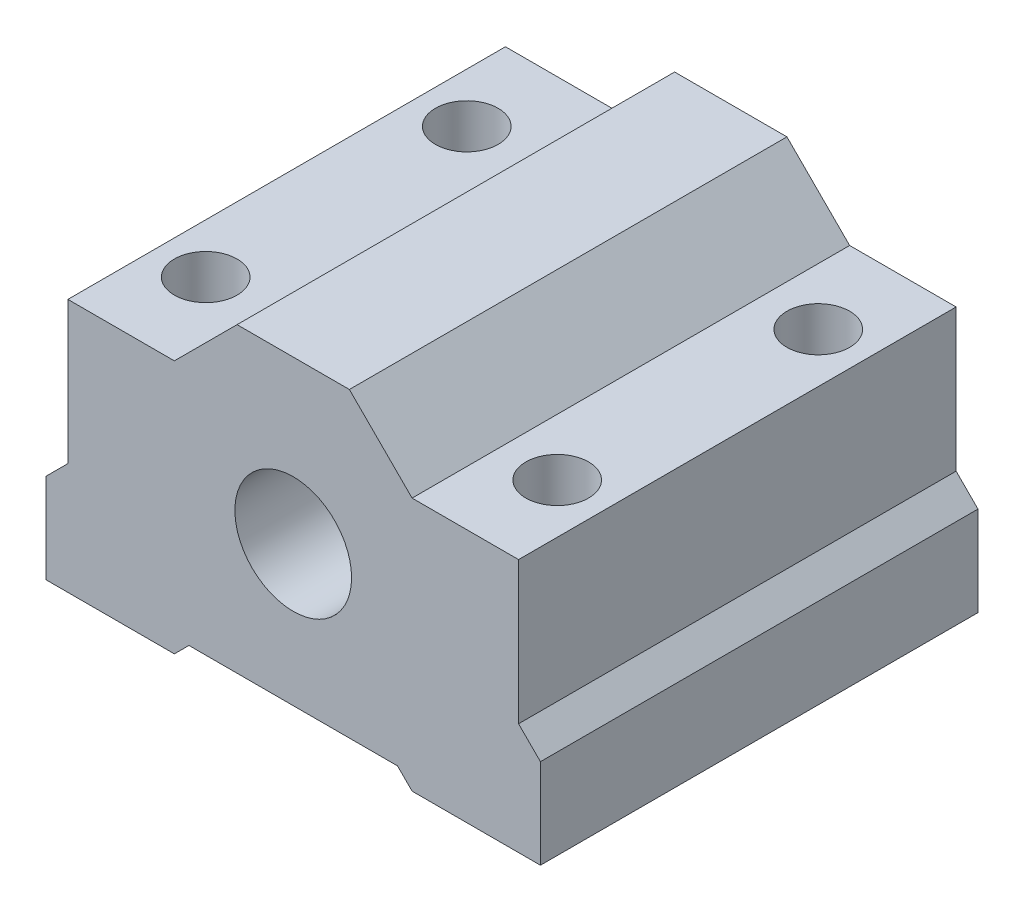
ISO-10303-21;
HEADER;
FILE_DESCRIPTION(('STEP AP214'),'2;1');
FILE_NAME('part.step','',(''),(''),'','','');
FILE_SCHEMA(('AUTOMOTIVE_DESIGN { 1 0 10303 214 1 1 1 1 }'));
ENDSEC;
DATA;
#1=APPLICATION_CONTEXT('core data for automotive mechanical design processes');
#2=APPLICATION_PROTOCOL_DEFINITION('international standard','automotive_design',2000,#1);
#3=PRODUCT_CONTEXT('',#1,'mechanical');
#4=PRODUCT('Part','Part','',(#3));
#5=PRODUCT_RELATED_PRODUCT_CATEGORY('part','',(#4));
#6=PRODUCT_DEFINITION_FORMATION('','',#4);
#7=PRODUCT_DEFINITION_CONTEXT('part definition',#1,'design');
#8=PRODUCT_DEFINITION('design','',#6,#7);
#9=PRODUCT_DEFINITION_SHAPE('','',#8);
#10=(LENGTH_UNIT() NAMED_UNIT(*) SI_UNIT(.MILLI.,.METRE.));
#11=(NAMED_UNIT(*) PLANE_ANGLE_UNIT() SI_UNIT($,.RADIAN.));
#12=(NAMED_UNIT(*) SI_UNIT($,.STERADIAN.) SOLID_ANGLE_UNIT());
#13=UNCERTAINTY_MEASURE_WITH_UNIT(LENGTH_MEASURE(1.E-05),#10,'distance_accuracy_value','');
#14=(GEOMETRIC_REPRESENTATION_CONTEXT(3) GLOBAL_UNCERTAINTY_ASSIGNED_CONTEXT((#13)) GLOBAL_UNIT_ASSIGNED_CONTEXT((#10,
#11,#12)) REPRESENTATION_CONTEXT('',''));
#15=CARTESIAN_POINT('',(0.,0.,0.));
#16=DIRECTION('',(0.,0.,1.));
#17=DIRECTION('',(1.,0.,0.));
#18=AXIS2_PLACEMENT_3D('',#15,#16,#17);
#19=CARTESIAN_POINT('',(0.,0.,30.));
#20=DIRECTION('',(0.,0.,-1.));
#21=DIRECTION('',(-1.,0.,0.));
#22=AXIS2_PLACEMENT_3D('',#19,#20,#21);
#23=PLANE('',#22);
#24=DIRECTION('',(1.,0.,0.));
#25=VECTOR('',#24,1.);
#26=CARTESIAN_POINT('',(0.,0.,30.));
#27=LINE('',#26,#25);
#28=CARTESIAN_POINT('',(0.,0.,30.));
#29=VERTEX_POINT('',#28);
#30=CARTESIAN_POINT('',(8.79999999999995,0.,30.));
#31=VERTEX_POINT('',#30);
#32=EDGE_CURVE('E218',#29,#31,#27,.T.);
#33=ORIENTED_EDGE('',*,*,#32,.T.);
#34=DIRECTION('',(0.707106781186569,0.707106781186526,0.));
#35=VECTOR('',#34,1.);
#36=CARTESIAN_POINT('',(8.79999999999995,0.,30.));
#37=LINE('',#36,#35);
#38=CARTESIAN_POINT('',(9.80000000000002,1.,30.));
#39=VERTEX_POINT('',#38);
#40=EDGE_CURVE('E126',#31,#39,#37,.T.);
#41=ORIENTED_EDGE('',*,*,#40,.T.);
#42=DIRECTION('',(1.,0.,0.));
#43=VECTOR('',#42,1.);
#44=CARTESIAN_POINT('',(9.80000000000002,1.,30.));
#45=LINE('',#44,#43);
#46=CARTESIAN_POINT('',(24.1,1.,30.));
#47=VERTEX_POINT('',#46);
#48=EDGE_CURVE('E292',#39,#47,#45,.T.);
#49=ORIENTED_EDGE('',*,*,#48,.T.);
#50=DIRECTION('',(0.707106781186565,-0.70710678118653,0.));
#51=VECTOR('',#50,1.);
#52=CARTESIAN_POINT('',(24.1,1.,30.));
#53=LINE('',#52,#51);
#54=CARTESIAN_POINT('',(25.1,0.,30.));
#55=VERTEX_POINT('',#54);
#56=EDGE_CURVE('E294',#47,#55,#53,.T.);
#57=ORIENTED_EDGE('',*,*,#56,.T.);
#58=DIRECTION('',(1.,0.,0.));
#59=VECTOR('',#58,1.);
#60=CARTESIAN_POINT('',(25.1,0.,30.));
#61=LINE('',#60,#59);
#62=CARTESIAN_POINT('',(33.9,0.,30.));
#63=VERTEX_POINT('',#62);
#64=EDGE_CURVE('E296',#55,#63,#61,.T.);
#65=ORIENTED_EDGE('',*,*,#64,.T.);
#66=DIRECTION('',(0.,1.,0.));
#67=VECTOR('',#66,1.);
#68=CARTESIAN_POINT('',(33.9,6.14999999999998,30.));
#69=LINE('',#68,#67);
#70=CARTESIAN_POINT('',(33.9,6.14999999999998,30.));
#71=VERTEX_POINT('',#70);
#72=EDGE_CURVE('E298',#63,#71,#69,.T.);
#73=ORIENTED_EDGE('',*,*,#72,.T.);
#74=DIRECTION('',(-0.707106781186546,0.707106781186549,0.));
#75=VECTOR('',#74,1.);
#76=CARTESIAN_POINT('',(32.4,7.65,30.));
#77=LINE('',#76,#75);
#78=CARTESIAN_POINT('',(32.4,7.65,30.));
#79=VERTEX_POINT('',#78);
#80=EDGE_CURVE('E300',#71,#79,#77,.T.);
#81=ORIENTED_EDGE('',*,*,#80,.T.);
#82=DIRECTION('',(0.,1.,0.));
#83=VECTOR('',#82,1.);
#84=CARTESIAN_POINT('',(32.4,17.4,30.));
#85=LINE('',#84,#83);
#86=CARTESIAN_POINT('',(32.4,17.4,30.));
#87=VERTEX_POINT('',#86);
#88=EDGE_CURVE('E302',#79,#87,#85,.T.);
#89=ORIENTED_EDGE('',*,*,#88,.T.);
#90=DIRECTION('',(-1.,0.,0.));
#91=VECTOR('',#90,1.);
#92=CARTESIAN_POINT('',(25.1,17.4,30.));
#93=LINE('',#92,#91);
#94=CARTESIAN_POINT('',(25.1,17.4,30.));
#95=VERTEX_POINT('',#94);
#96=EDGE_CURVE('E304',#87,#95,#93,.T.);
#97=ORIENTED_EDGE('',*,*,#96,.T.);
#98=DIRECTION('',(-0.707106781186546,0.707106781186549,0.));
#99=VECTOR('',#98,1.);
#100=CARTESIAN_POINT('',(20.8000000000001,21.7,30.));
#101=LINE('',#100,#99);
#102=CARTESIAN_POINT('',(20.8000000000001,21.7,30.));
#103=VERTEX_POINT('',#102);
#104=EDGE_CURVE('E306',#95,#103,#101,.T.);
#105=ORIENTED_EDGE('',*,*,#104,.T.);
#106=DIRECTION('',(-1.,0.,0.));
#107=VECTOR('',#106,1.);
#108=CARTESIAN_POINT('',(13.1000000000001,21.7,30.));
#109=LINE('',#108,#107);
#110=CARTESIAN_POINT('',(13.1000000000001,21.7,30.));
#111=VERTEX_POINT('',#110);
#112=EDGE_CURVE('E308',#103,#111,#109,.T.);
#113=ORIENTED_EDGE('',*,*,#112,.T.);
#114=DIRECTION('',(-0.707106781186549,-0.707106781186546,0.));
#115=VECTOR('',#114,1.);
#116=CARTESIAN_POINT('',(8.80000000000005,17.4,30.));
#117=LINE('',#116,#115);
#118=CARTESIAN_POINT('',(8.80000000000005,17.4,30.));
#119=VERTEX_POINT('',#118);
#120=EDGE_CURVE('E310',#111,#119,#117,.T.);
#121=ORIENTED_EDGE('',*,*,#120,.T.);
#122=DIRECTION('',(-1.,0.,0.));
#123=VECTOR('',#122,1.);
#124=CARTESIAN_POINT('',(1.50000000000005,17.4,30.));
#125=LINE('',#124,#123);
#126=CARTESIAN_POINT('',(1.50000000000005,17.4,30.));
#127=VERTEX_POINT('',#126);
#128=EDGE_CURVE('E169',#119,#127,#125,.T.);
#129=ORIENTED_EDGE('',*,*,#128,.T.);
#130=DIRECTION('',(0.,-1.,0.));
#131=VECTOR('',#130,1.);
#132=CARTESIAN_POINT('',(1.49999999999999,7.65,30.));
#133=LINE('',#132,#131);
#134=CARTESIAN_POINT('',(1.49999999999999,7.65,30.));
#135=VERTEX_POINT('',#134);
#136=EDGE_CURVE('E163',#127,#135,#133,.T.);
#137=ORIENTED_EDGE('',*,*,#136,.T.);
#138=DIRECTION('',(-0.707106781186549,-0.707106781186546,0.));
#139=VECTOR('',#138,1.);
#140=CARTESIAN_POINT('',(0.,6.15000000000001,30.));
#141=LINE('',#140,#139);
#142=CARTESIAN_POINT('',(0.,6.15000000000001,30.));
#143=VERTEX_POINT('',#142);
#144=EDGE_CURVE('E167',#135,#143,#141,.T.);
#145=ORIENTED_EDGE('',*,*,#144,.T.);
#146=DIRECTION('',(0.,-1.,0.));
#147=VECTOR('',#146,1.);
#148=CARTESIAN_POINT('',(0.,0.,30.));
#149=LINE('',#148,#147);
#150=EDGE_CURVE('E59',#143,#29,#149,.T.);
#151=ORIENTED_EDGE('',*,*,#150,.T.);
#152=EDGE_LOOP('',(#33,#41,#49,#57,#65,#73,#81,#89,#97,#105,#113,#121,#129,#137,#145,#151));
#153=FACE_BOUND('',#152,.T.);
#154=CARTESIAN_POINT('',(16.95,10.6,30.));
#155=DIRECTION('',(0.,0.,1.));
#156=DIRECTION('',(1.,0.,0.));
#157=AXIS2_PLACEMENT_3D('',#154,#155,#156);
#158=CIRCLE('',#157,4.);
#159=CARTESIAN_POINT('',(20.95,10.6,30.));
#160=VERTEX_POINT('',#159);
#161=EDGE_CURVE('E191',#160,#160,#158,.T.);
#162=ORIENTED_EDGE('',*,*,#161,.F.);
#163=EDGE_LOOP('',(#162));
#164=FACE_BOUND('',#163,.T.);
#165=ADVANCED_FACE('F40',(#153,#164),#23,.F.);
#166=CARTESIAN_POINT('',(0.,0.,0.));
#167=DIRECTION('',(0.,0.,-1.));
#168=DIRECTION('',(-1.,0.,0.));
#169=AXIS2_PLACEMENT_3D('',#166,#167,#168);
#170=PLANE('',#169);
#171=DIRECTION('',(1.,0.,0.));
#172=VECTOR('',#171,1.);
#173=CARTESIAN_POINT('',(0.,0.,0.));
#174=LINE('',#173,#172);
#175=CARTESIAN_POINT('',(0.,0.,0.));
#176=VERTEX_POINT('',#175);
#177=CARTESIAN_POINT('',(8.79999999999995,0.,0.));
#178=VERTEX_POINT('',#177);
#179=EDGE_CURVE('E187',#176,#178,#174,.T.);
#180=ORIENTED_EDGE('',*,*,#179,.F.);
#181=DIRECTION('',(0.,-1.,0.));
#182=VECTOR('',#181,1.);
#183=CARTESIAN_POINT('',(0.,0.,0.));
#184=LINE('',#183,#182);
#185=CARTESIAN_POINT('',(0.,6.15000000000001,0.));
#186=VERTEX_POINT('',#185);
#187=EDGE_CURVE('E118',#186,#176,#184,.T.);
#188=ORIENTED_EDGE('',*,*,#187,.F.);
#189=DIRECTION('',(-0.707106781186549,-0.707106781186546,0.));
#190=VECTOR('',#189,1.);
#191=CARTESIAN_POINT('',(0.,6.15000000000001,0.));
#192=LINE('',#191,#190);
#193=CARTESIAN_POINT('',(1.49999999999999,7.65,0.));
#194=VERTEX_POINT('',#193);
#195=EDGE_CURVE('E112',#194,#186,#192,.T.);
#196=ORIENTED_EDGE('',*,*,#195,.F.);
#197=DIRECTION('',(0.,-1.,0.));
#198=VECTOR('',#197,1.);
#199=CARTESIAN_POINT('',(1.49999999999999,7.65,0.));
#200=LINE('',#199,#198);
#201=CARTESIAN_POINT('',(1.50000000000005,17.4,0.));
#202=VERTEX_POINT('',#201);
#203=EDGE_CURVE('E177',#202,#194,#200,.T.);
#204=ORIENTED_EDGE('',*,*,#203,.F.);
#205=DIRECTION('',(-1.,0.,0.));
#206=VECTOR('',#205,1.);
#207=CARTESIAN_POINT('',(1.50000000000005,17.4,0.));
#208=LINE('',#207,#206);
#209=CARTESIAN_POINT('',(8.80000000000005,17.4,0.));
#210=VERTEX_POINT('',#209);
#211=EDGE_CURVE('E213',#210,#202,#208,.T.);
#212=ORIENTED_EDGE('',*,*,#211,.F.);
#213=DIRECTION('',(-0.707106781186549,-0.707106781186546,0.));
#214=VECTOR('',#213,1.);
#215=CARTESIAN_POINT('',(8.80000000000005,17.4,0.));
#216=LINE('',#215,#214);
#217=CARTESIAN_POINT('',(13.1000000000001,21.7,0.));
#218=VERTEX_POINT('',#217);
#219=EDGE_CURVE('E211',#218,#210,#216,.T.);
#220=ORIENTED_EDGE('',*,*,#219,.F.);
#221=DIRECTION('',(-1.,0.,0.));
#222=VECTOR('',#221,1.);
#223=CARTESIAN_POINT('',(13.1000000000001,21.7,0.));
#224=LINE('',#223,#222);
#225=CARTESIAN_POINT('',(20.8000000000001,21.7,0.));
#226=VERTEX_POINT('',#225);
#227=EDGE_CURVE('E209',#226,#218,#224,.T.);
#228=ORIENTED_EDGE('',*,*,#227,.F.);
#229=DIRECTION('',(-0.707106781186546,0.707106781186549,0.));
#230=VECTOR('',#229,1.);
#231=CARTESIAN_POINT('',(20.8000000000001,21.7,0.));
#232=LINE('',#231,#230);
#233=CARTESIAN_POINT('',(25.1,17.4,0.));
#234=VERTEX_POINT('',#233);
#235=EDGE_CURVE('E207',#234,#226,#232,.T.);
#236=ORIENTED_EDGE('',*,*,#235,.F.);
#237=DIRECTION('',(-1.,0.,0.));
#238=VECTOR('',#237,1.);
#239=CARTESIAN_POINT('',(25.1,17.4,0.));
#240=LINE('',#239,#238);
#241=CARTESIAN_POINT('',(32.4,17.4,0.));
#242=VERTEX_POINT('',#241);
#243=EDGE_CURVE('E205',#242,#234,#240,.T.);
#244=ORIENTED_EDGE('',*,*,#243,.F.);
#245=DIRECTION('',(0.,1.,0.));
#246=VECTOR('',#245,1.);
#247=CARTESIAN_POINT('',(32.4,17.4,0.));
#248=LINE('',#247,#246);
#249=CARTESIAN_POINT('',(32.4,7.65,0.));
#250=VERTEX_POINT('',#249);
#251=EDGE_CURVE('E203',#250,#242,#248,.T.);
#252=ORIENTED_EDGE('',*,*,#251,.F.);
#253=DIRECTION('',(-0.707106781186546,0.707106781186549,0.));
#254=VECTOR('',#253,1.);
#255=CARTESIAN_POINT('',(32.4,7.65,0.));
#256=LINE('',#255,#254);
#257=CARTESIAN_POINT('',(33.9,6.14999999999998,0.));
#258=VERTEX_POINT('',#257);
#259=EDGE_CURVE('E201',#258,#250,#256,.T.);
#260=ORIENTED_EDGE('',*,*,#259,.F.);
#261=DIRECTION('',(0.,1.,0.));
#262=VECTOR('',#261,1.);
#263=CARTESIAN_POINT('',(33.9,6.14999999999998,0.));
#264=LINE('',#263,#262);
#265=CARTESIAN_POINT('',(33.9,0.,0.));
#266=VERTEX_POINT('',#265);
#267=EDGE_CURVE('E199',#266,#258,#264,.T.);
#268=ORIENTED_EDGE('',*,*,#267,.F.);
#269=DIRECTION('',(1.,0.,0.));
#270=VECTOR('',#269,1.);
#271=CARTESIAN_POINT('',(25.1,0.,0.));
#272=LINE('',#271,#270);
#273=CARTESIAN_POINT('',(25.1,0.,0.));
#274=VERTEX_POINT('',#273);
#275=EDGE_CURVE('E197',#274,#266,#272,.T.);
#276=ORIENTED_EDGE('',*,*,#275,.F.);
#277=DIRECTION('',(0.707106781186565,-0.70710678118653,0.));
#278=VECTOR('',#277,1.);
#279=CARTESIAN_POINT('',(24.1,1.,0.));
#280=LINE('',#279,#278);
#281=CARTESIAN_POINT('',(24.1,1.,0.));
#282=VERTEX_POINT('',#281);
#283=EDGE_CURVE('E195',#282,#274,#280,.T.);
#284=ORIENTED_EDGE('',*,*,#283,.F.);
#285=DIRECTION('',(1.,0.,0.));
#286=VECTOR('',#285,1.);
#287=CARTESIAN_POINT('',(9.80000000000002,1.,0.));
#288=LINE('',#287,#286);
#289=CARTESIAN_POINT('',(9.80000000000002,1.,0.));
#290=VERTEX_POINT('',#289);
#291=EDGE_CURVE('E193',#290,#282,#288,.T.);
#292=ORIENTED_EDGE('',*,*,#291,.F.);
#293=DIRECTION('',(0.707106781186569,0.707106781186526,0.));
#294=VECTOR('',#293,1.);
#295=CARTESIAN_POINT('',(8.79999999999995,0.,0.));
#296=LINE('',#295,#294);
#297=EDGE_CURVE('E190',#178,#290,#296,.T.);
#298=ORIENTED_EDGE('',*,*,#297,.F.);
#299=EDGE_LOOP('',(#180,#188,#196,#204,#212,#220,#228,#236,#244,#252,#260,#268,#276,#284,#292,#298));
#300=FACE_BOUND('',#299,.T.);
#301=CARTESIAN_POINT('',(16.95,10.6,0.));
#302=DIRECTION('',(0.,0.,1.));
#303=DIRECTION('',(1.,0.,0.));
#304=AXIS2_PLACEMENT_3D('',#301,#302,#303);
#305=CIRCLE('',#304,4.);
#306=CARTESIAN_POINT('',(20.95,10.6,0.));
#307=VERTEX_POINT('',#306);
#308=EDGE_CURVE('E257',#307,#307,#305,.T.);
#309=ORIENTED_EDGE('',*,*,#308,.T.);
#310=EDGE_LOOP('',(#309));
#311=FACE_BOUND('',#310,.T.);
#312=ADVANCED_FACE('F323',(#300,#311),#170,.T.);
#313=CARTESIAN_POINT('',(0.,0.,30.));
#314=DIRECTION('',(0.,1.,0.));
#315=DIRECTION('',(-1.,0.,0.));
#316=AXIS2_PLACEMENT_3D('',#313,#314,#315);
#317=PLANE('',#316);
#318=CARTESIAN_POINT('',(4.90000000000001,0.,6.05));
#319=DIRECTION('',(0.,-1.,0.));
#320=DIRECTION('',(0.,0.,-1.));
#321=AXIS2_PLACEMENT_3D('',#318,#319,#320);
#322=CIRCLE('',#321,2.98);
#323=CARTESIAN_POINT('',(4.90000000000001,0.,3.07));
#324=VERTEX_POINT('',#323);
#325=EDGE_CURVE('E385',#324,#324,#322,.T.);
#326=ORIENTED_EDGE('',*,*,#325,.F.);
#327=EDGE_LOOP('',(#326));
#328=FACE_BOUND('',#327,.T.);
#329=CARTESIAN_POINT('',(4.90000000000001,0.,23.95));
#330=DIRECTION('',(0.,-1.,0.));
#331=DIRECTION('',(0.,0.,-1.));
#332=AXIS2_PLACEMENT_3D('',#329,#330,#331);
#333=CIRCLE('',#332,2.98);
#334=CARTESIAN_POINT('',(4.90000000000001,0.,20.97));
#335=VERTEX_POINT('',#334);
#336=EDGE_CURVE('E272',#335,#335,#333,.T.);
#337=ORIENTED_EDGE('',*,*,#336,.F.);
#338=EDGE_LOOP('',(#337));
#339=FACE_BOUND('',#338,.T.);
#340=ORIENTED_EDGE('',*,*,#179,.T.);
#341=DIRECTION('',(0.,0.,-1.));
#342=VECTOR('',#341,1.);
#343=CARTESIAN_POINT('',(8.79999999999995,0.,30.));
#344=LINE('',#343,#342);
#345=EDGE_CURVE('E11',#31,#178,#344,.T.);
#346=ORIENTED_EDGE('',*,*,#345,.F.);
#347=ORIENTED_EDGE('',*,*,#32,.F.);
#348=DIRECTION('',(0.,0.,-1.));
#349=VECTOR('',#348,1.);
#350=CARTESIAN_POINT('',(0.,0.,30.));
#351=LINE('',#350,#349);
#352=EDGE_CURVE('E183',#29,#176,#351,.T.);
#353=ORIENTED_EDGE('',*,*,#352,.T.);
#354=EDGE_LOOP('',(#340,#346,#347,#353));
#355=FACE_BOUND('',#354,.T.);
#356=ADVANCED_FACE('F42',(#328,#339,#355),#317,.F.);
#357=CARTESIAN_POINT('',(8.79999999999995,0.,30.));
#358=DIRECTION('',(-0.707106781186526,0.707106781186569,0.));
#359=DIRECTION('',(-0.707106781186569,-0.707106781186526,0.));
#360=AXIS2_PLACEMENT_3D('',#357,#358,#359);
#361=PLANE('',#360);
#362=ORIENTED_EDGE('',*,*,#297,.T.);
#363=DIRECTION('',(0.,0.,-1.));
#364=VECTOR('',#363,1.);
#365=CARTESIAN_POINT('',(9.80000000000002,1.,30.));
#366=LINE('',#365,#364);
#367=EDGE_CURVE('E50',#39,#290,#366,.T.);
#368=ORIENTED_EDGE('',*,*,#367,.F.);
#369=ORIENTED_EDGE('',*,*,#40,.F.);
#370=ORIENTED_EDGE('',*,*,#345,.T.);
#371=EDGE_LOOP('',(#362,#368,#369,#370));
#372=FACE_BOUND('',#371,.T.);
#373=ADVANCED_FACE('F435',(#372),#361,.F.);
#374=CARTESIAN_POINT('',(9.80000000000002,1.,30.));
#375=DIRECTION('',(0.,1.,0.));
#376=DIRECTION('',(0.,0.,1.));
#377=AXIS2_PLACEMENT_3D('',#374,#375,#376);
#378=PLANE('',#377);
#379=ORIENTED_EDGE('',*,*,#291,.T.);
#380=DIRECTION('',(0.,0.,-1.));
#381=VECTOR('',#380,1.);
#382=CARTESIAN_POINT('',(24.1,1.,30.));
#383=LINE('',#382,#381);
#384=EDGE_CURVE('E249',#47,#282,#383,.T.);
#385=ORIENTED_EDGE('',*,*,#384,.F.);
#386=ORIENTED_EDGE('',*,*,#48,.F.);
#387=ORIENTED_EDGE('',*,*,#367,.T.);
#388=EDGE_LOOP('',(#379,#385,#386,#387));
#389=FACE_BOUND('',#388,.T.);
#390=ADVANCED_FACE('F432',(#389),#378,.F.);
#391=CARTESIAN_POINT('',(24.1,1.,30.));
#392=DIRECTION('',(0.70710678118653,0.707106781186565,0.));
#393=DIRECTION('',(-0.707106781186565,0.70710678118653,0.));
#394=AXIS2_PLACEMENT_3D('',#391,#392,#393);
#395=PLANE('',#394);
#396=ORIENTED_EDGE('',*,*,#283,.T.);
#397=DIRECTION('',(0.,0.,-1.));
#398=VECTOR('',#397,1.);
#399=CARTESIAN_POINT('',(25.1,0.,30.));
#400=LINE('',#399,#398);
#401=EDGE_CURVE('E246',#55,#274,#400,.T.);
#402=ORIENTED_EDGE('',*,*,#401,.F.);
#403=ORIENTED_EDGE('',*,*,#56,.F.);
#404=ORIENTED_EDGE('',*,*,#384,.T.);
#405=EDGE_LOOP('',(#396,#402,#403,#404));
#406=FACE_BOUND('',#405,.T.);
#407=ADVANCED_FACE('F428',(#406),#395,.F.);
#408=CARTESIAN_POINT('',(25.1,0.,30.));
#409=DIRECTION('',(0.,1.,0.));
#410=DIRECTION('',(-1.,0.,0.));
#411=AXIS2_PLACEMENT_3D('',#408,#409,#410);
#412=PLANE('',#411);
#413=CARTESIAN_POINT('',(29.,0.,6.05));
#414=DIRECTION('',(0.,-1.,0.));
#415=DIRECTION('',(0.,0.,-1.));
#416=AXIS2_PLACEMENT_3D('',#413,#414,#415);
#417=CIRCLE('',#416,2.98);
#418=CARTESIAN_POINT('',(29.,0.,3.07));
#419=VERTEX_POINT('',#418);
#420=EDGE_CURVE('E265',#419,#419,#417,.T.);
#421=ORIENTED_EDGE('',*,*,#420,.F.);
#422=EDGE_LOOP('',(#421));
#423=FACE_BOUND('',#422,.T.);
#424=CARTESIAN_POINT('',(29.,0.,23.95));
#425=DIRECTION('',(0.,-1.,0.));
#426=DIRECTION('',(0.,0.,-1.));
#427=AXIS2_PLACEMENT_3D('',#424,#425,#426);
#428=CIRCLE('',#427,2.98);
#429=CARTESIAN_POINT('',(29.,0.,20.97));
#430=VERTEX_POINT('',#429);
#431=EDGE_CURVE('E261',#430,#430,#428,.T.);
#432=ORIENTED_EDGE('',*,*,#431,.F.);
#433=EDGE_LOOP('',(#432));
#434=FACE_BOUND('',#433,.T.);
#435=ORIENTED_EDGE('',*,*,#275,.T.);
#436=DIRECTION('',(0.,0.,-1.));
#437=VECTOR('',#436,1.);
#438=CARTESIAN_POINT('',(33.9,0.,30.));
#439=LINE('',#438,#437);
#440=EDGE_CURVE('E243',#63,#266,#439,.T.);
#441=ORIENTED_EDGE('',*,*,#440,.F.);
#442=ORIENTED_EDGE('',*,*,#64,.F.);
#443=ORIENTED_EDGE('',*,*,#401,.T.);
#444=EDGE_LOOP('',(#435,#441,#442,#443));
#445=FACE_BOUND('',#444,.T.);
#446=ADVANCED_FACE('F424',(#423,#434,#445),#412,.F.);
#447=CARTESIAN_POINT('',(33.9,6.14999999999998,30.));
#448=DIRECTION('',(-1.,0.,0.));
#449=DIRECTION('',(0.,0.,1.));
#450=AXIS2_PLACEMENT_3D('',#447,#448,#449);
#451=PLANE('',#450);
#452=ORIENTED_EDGE('',*,*,#267,.T.);
#453=DIRECTION('',(0.,0.,-1.));
#454=VECTOR('',#453,1.);
#455=CARTESIAN_POINT('',(33.9,6.14999999999998,30.));
#456=LINE('',#455,#454);
#457=EDGE_CURVE('E240',#71,#258,#456,.T.);
#458=ORIENTED_EDGE('',*,*,#457,.F.);
#459=ORIENTED_EDGE('',*,*,#72,.F.);
#460=ORIENTED_EDGE('',*,*,#440,.T.);
#461=EDGE_LOOP('',(#452,#458,#459,#460));
#462=FACE_BOUND('',#461,.T.);
#463=ADVANCED_FACE('F420',(#462),#451,.F.);
#464=CARTESIAN_POINT('',(32.4,7.65,30.));
#465=DIRECTION('',(-0.707106781186549,-0.707106781186546,0.));
#466=DIRECTION('',(0.707106781186546,-0.707106781186549,0.));
#467=AXIS2_PLACEMENT_3D('',#464,#465,#466);
#468=PLANE('',#467);
#469=ORIENTED_EDGE('',*,*,#259,.T.);
#470=DIRECTION('',(0.,0.,-1.));
#471=VECTOR('',#470,1.);
#472=CARTESIAN_POINT('',(32.4,7.65,30.));
#473=LINE('',#472,#471);
#474=EDGE_CURVE('E237',#79,#250,#473,.T.);
#475=ORIENTED_EDGE('',*,*,#474,.F.);
#476=ORIENTED_EDGE('',*,*,#80,.F.);
#477=ORIENTED_EDGE('',*,*,#457,.T.);
#478=EDGE_LOOP('',(#469,#475,#476,#477));
#479=FACE_BOUND('',#478,.T.);
#480=ADVANCED_FACE('F416',(#479),#468,.F.);
#481=CARTESIAN_POINT('',(32.4,17.4,30.));
#482=DIRECTION('',(-1.,0.,0.));
#483=DIRECTION('',(0.,-1.,0.));
#484=AXIS2_PLACEMENT_3D('',#481,#482,#483);
#485=PLANE('',#484);
#486=ORIENTED_EDGE('',*,*,#251,.T.);
#487=DIRECTION('',(0.,0.,-1.));
#488=VECTOR('',#487,1.);
#489=CARTESIAN_POINT('',(32.4,17.4,30.));
#490=LINE('',#489,#488);
#491=EDGE_CURVE('E234',#87,#242,#490,.T.);
#492=ORIENTED_EDGE('',*,*,#491,.F.);
#493=ORIENTED_EDGE('',*,*,#88,.F.);
#494=ORIENTED_EDGE('',*,*,#474,.T.);
#495=EDGE_LOOP('',(#486,#492,#493,#494));
#496=FACE_BOUND('',#495,.T.);
#497=ADVANCED_FACE('F412',(#496),#485,.F.);
#498=CARTESIAN_POINT('',(25.1,17.4,30.));
#499=DIRECTION('',(0.,-1.,0.));
#500=DIRECTION('',(0.,0.,-1.));
#501=AXIS2_PLACEMENT_3D('',#498,#499,#500);
#502=PLANE('',#501);
#503=CARTESIAN_POINT('',(29.,17.4,6.05));
#504=DIRECTION('',(0.,-1.,0.));
#505=DIRECTION('',(0.,0.,-1.));
#506=AXIS2_PLACEMENT_3D('',#503,#504,#505);
#507=CIRCLE('',#506,2.15);
#508=CARTESIAN_POINT('',(29.,17.4,3.9));
#509=VERTEX_POINT('',#508);
#510=EDGE_CURVE('E259',#509,#509,#507,.T.);
#511=ORIENTED_EDGE('',*,*,#510,.T.);
#512=EDGE_LOOP('',(#511));
#513=FACE_BOUND('',#512,.T.);
#514=CARTESIAN_POINT('',(29.,17.4,23.95));
#515=DIRECTION('',(0.,-1.,0.));
#516=DIRECTION('',(0.,0.,-1.));
#517=AXIS2_PLACEMENT_3D('',#514,#515,#516);
#518=CIRCLE('',#517,2.15);
#519=CARTESIAN_POINT('',(29.,17.4,21.8));
#520=VERTEX_POINT('',#519);
#521=EDGE_CURVE('E254',#520,#520,#518,.T.);
#522=ORIENTED_EDGE('',*,*,#521,.T.);
#523=EDGE_LOOP('',(#522));
#524=FACE_BOUND('',#523,.T.);
#525=ORIENTED_EDGE('',*,*,#243,.T.);
#526=DIRECTION('',(0.,0.,-1.));
#527=VECTOR('',#526,1.);
#528=CARTESIAN_POINT('',(25.1,17.4,30.));
#529=LINE('',#528,#527);
#530=EDGE_CURVE('E231',#95,#234,#529,.T.);
#531=ORIENTED_EDGE('',*,*,#530,.F.);
#532=ORIENTED_EDGE('',*,*,#96,.F.);
#533=ORIENTED_EDGE('',*,*,#491,.T.);
#534=EDGE_LOOP('',(#525,#531,#532,#533));
#535=FACE_BOUND('',#534,.T.);
#536=ADVANCED_FACE('F409',(#513,#524,#535),#502,.F.);
#537=CARTESIAN_POINT('',(20.8000000000001,21.7,30.));
#538=DIRECTION('',(-0.707106781186549,-0.707106781186546,0.));
#539=DIRECTION('',(0.707106781186546,-0.707106781186549,0.));
#540=AXIS2_PLACEMENT_3D('',#537,#538,#539);
#541=PLANE('',#540);
#542=ORIENTED_EDGE('',*,*,#235,.T.);
#543=DIRECTION('',(0.,0.,-1.));
#544=VECTOR('',#543,1.);
#545=CARTESIAN_POINT('',(20.8000000000001,21.7,30.));
#546=LINE('',#545,#544);
#547=EDGE_CURVE('E228',#103,#226,#546,.T.);
#548=ORIENTED_EDGE('',*,*,#547,.F.);
#549=ORIENTED_EDGE('',*,*,#104,.F.);
#550=ORIENTED_EDGE('',*,*,#530,.T.);
#551=EDGE_LOOP('',(#542,#548,#549,#550));
#552=FACE_BOUND('',#551,.T.);
#553=ADVANCED_FACE('F405',(#552),#541,.F.);
#554=CARTESIAN_POINT('',(13.1000000000001,21.7,30.));
#555=DIRECTION('',(0.,-1.,0.));
#556=DIRECTION('',(0.,0.,-1.));
#557=AXIS2_PLACEMENT_3D('',#554,#555,#556);
#558=PLANE('',#557);
#559=ORIENTED_EDGE('',*,*,#227,.T.);
#560=DIRECTION('',(0.,0.,-1.));
#561=VECTOR('',#560,1.);
#562=CARTESIAN_POINT('',(13.1000000000001,21.7,30.));
#563=LINE('',#562,#561);
#564=EDGE_CURVE('E225',#111,#218,#563,.T.);
#565=ORIENTED_EDGE('',*,*,#564,.F.);
#566=ORIENTED_EDGE('',*,*,#112,.F.);
#567=ORIENTED_EDGE('',*,*,#547,.T.);
#568=EDGE_LOOP('',(#559,#565,#566,#567));
#569=FACE_BOUND('',#568,.T.);
#570=ADVANCED_FACE('F400',(#569),#558,.F.);
#571=CARTESIAN_POINT('',(8.80000000000005,17.4,30.));
#572=DIRECTION('',(0.707106781186546,-0.707106781186549,0.));
#573=DIRECTION('',(0.707106781186549,0.707106781186546,0.));
#574=AXIS2_PLACEMENT_3D('',#571,#572,#573);
#575=PLANE('',#574);
#576=ORIENTED_EDGE('',*,*,#219,.T.);
#577=DIRECTION('',(0.,0.,-1.));
#578=VECTOR('',#577,1.);
#579=CARTESIAN_POINT('',(8.80000000000005,17.4,30.));
#580=LINE('',#579,#578);
#581=EDGE_CURVE('E222',#119,#210,#580,.T.);
#582=ORIENTED_EDGE('',*,*,#581,.F.);
#583=ORIENTED_EDGE('',*,*,#120,.F.);
#584=ORIENTED_EDGE('',*,*,#564,.T.);
#585=EDGE_LOOP('',(#576,#582,#583,#584));
#586=FACE_BOUND('',#585,.T.);
#587=ADVANCED_FACE('F316',(#586),#575,.F.);
#588=CARTESIAN_POINT('',(1.50000000000005,17.4,30.));
#589=DIRECTION('',(0.,-1.,0.));
#590=DIRECTION('',(0.,0.,-1.));
#591=AXIS2_PLACEMENT_3D('',#588,#589,#590);
#592=PLANE('',#591);
#593=CARTESIAN_POINT('',(4.90000000000001,17.4,6.05));
#594=DIRECTION('',(0.,-1.,0.));
#595=DIRECTION('',(0.,0.,-1.));
#596=AXIS2_PLACEMENT_3D('',#593,#594,#595);
#597=CIRCLE('',#596,2.15);
#598=CARTESIAN_POINT('',(4.90000000000001,17.4,3.9));
#599=VERTEX_POINT('',#598);
#600=EDGE_CURVE('E44',#599,#599,#597,.T.);
#601=ORIENTED_EDGE('',*,*,#600,.T.);
#602=EDGE_LOOP('',(#601));
#603=FACE_BOUND('',#602,.T.);
#604=CARTESIAN_POINT('',(4.90000000000001,17.4,23.95));
#605=DIRECTION('',(0.,-1.,0.));
#606=DIRECTION('',(0.,0.,-1.));
#607=AXIS2_PLACEMENT_3D('',#604,#605,#606);
#608=CIRCLE('',#607,2.15);
#609=CARTESIAN_POINT('',(4.90000000000001,17.4,21.8));
#610=VERTEX_POINT('',#609);
#611=EDGE_CURVE('E263',#610,#610,#608,.T.);
#612=ORIENTED_EDGE('',*,*,#611,.T.);
#613=EDGE_LOOP('',(#612));
#614=FACE_BOUND('',#613,.T.);
#615=ORIENTED_EDGE('',*,*,#211,.T.);
#616=DIRECTION('',(0.,0.,-1.));
#617=VECTOR('',#616,1.);
#618=CARTESIAN_POINT('',(1.50000000000005,17.4,30.));
#619=LINE('',#618,#617);
#620=EDGE_CURVE('E178',#127,#202,#619,.T.);
#621=ORIENTED_EDGE('',*,*,#620,.F.);
#622=ORIENTED_EDGE('',*,*,#128,.F.);
#623=ORIENTED_EDGE('',*,*,#581,.T.);
#624=EDGE_LOOP('',(#615,#621,#622,#623));
#625=FACE_BOUND('',#624,.T.);
#626=ADVANCED_FACE('F320',(#603,#614,#625),#592,.F.);
#627=CARTESIAN_POINT('',(1.49999999999999,7.65,30.));
#628=DIRECTION('',(1.,0.,0.));
#629=DIRECTION('',(0.,1.,0.));
#630=AXIS2_PLACEMENT_3D('',#627,#628,#629);
#631=PLANE('',#630);
#632=ORIENTED_EDGE('',*,*,#203,.T.);
#633=DIRECTION('',(0.,0.,-1.));
#634=VECTOR('',#633,1.);
#635=CARTESIAN_POINT('',(1.49999999999999,7.65,30.));
#636=LINE('',#635,#634);
#637=EDGE_CURVE('E174',#135,#194,#636,.T.);
#638=ORIENTED_EDGE('',*,*,#637,.F.);
#639=ORIENTED_EDGE('',*,*,#136,.F.);
#640=ORIENTED_EDGE('',*,*,#620,.T.);
#641=EDGE_LOOP('',(#632,#638,#639,#640));
#642=FACE_BOUND('',#641,.T.);
#643=ADVANCED_FACE('F175',(#642),#631,.F.);
#644=CARTESIAN_POINT('',(0.,6.15000000000001,30.));
#645=DIRECTION('',(0.707106781186546,-0.707106781186549,0.));
#646=DIRECTION('',(0.707106781186549,0.707106781186546,0.));
#647=AXIS2_PLACEMENT_3D('',#644,#645,#646);
#648=PLANE('',#647);
#649=ORIENTED_EDGE('',*,*,#195,.T.);
#650=DIRECTION('',(0.,0.,-1.));
#651=VECTOR('',#650,1.);
#652=CARTESIAN_POINT('',(0.,6.15000000000001,30.));
#653=LINE('',#652,#651);
#654=EDGE_CURVE('E179',#143,#186,#653,.T.);
#655=ORIENTED_EDGE('',*,*,#654,.F.);
#656=ORIENTED_EDGE('',*,*,#144,.F.);
#657=ORIENTED_EDGE('',*,*,#637,.T.);
#658=EDGE_LOOP('',(#649,#655,#656,#657));
#659=FACE_BOUND('',#658,.T.);
#660=ADVANCED_FACE('F181',(#659),#648,.F.);
#661=CARTESIAN_POINT('',(0.,0.,30.));
#662=DIRECTION('',(1.,0.,0.));
#663=DIRECTION('',(0.,0.,-1.));
#664=AXIS2_PLACEMENT_3D('',#661,#662,#663);
#665=PLANE('',#664);
#666=ORIENTED_EDGE('',*,*,#187,.T.);
#667=ORIENTED_EDGE('',*,*,#352,.F.);
#668=ORIENTED_EDGE('',*,*,#150,.F.);
#669=ORIENTED_EDGE('',*,*,#654,.T.);
#670=EDGE_LOOP('',(#666,#667,#668,#669));
#671=FACE_BOUND('',#670,.T.);
#672=ADVANCED_FACE('F329',(#671),#665,.F.);
#673=CARTESIAN_POINT('',(16.95,10.6,30.));
#674=DIRECTION('',(0.,0.,-1.));
#675=DIRECTION('',(-1.,0.,0.));
#676=AXIS2_PLACEMENT_3D('',#673,#674,#675);
#677=CYLINDRICAL_SURFACE('',#676,4.);
#678=ORIENTED_EDGE('',*,*,#161,.T.);
#679=EDGE_LOOP('',(#678));
#680=FACE_BOUND('',#679,.T.);
#681=ORIENTED_EDGE('',*,*,#308,.F.);
#682=EDGE_LOOP('',(#681));
#683=FACE_BOUND('',#682,.T.);
#684=ADVANCED_FACE('F331',(#680,#683),#677,.F.);
#685=CARTESIAN_POINT('',(29.,0.,23.95));
#686=DIRECTION('',(0.,-1.,0.));
#687=DIRECTION('',(0.,0.,-1.));
#688=AXIS2_PLACEMENT_3D('',#685,#686,#687);
#689=CYLINDRICAL_SURFACE('',#688,2.15);
#690=CARTESIAN_POINT('',(29.,0.829999999999997,23.95));
#691=DIRECTION('',(0.,-1.,0.));
#692=DIRECTION('',(0.,0.,-1.));
#693=AXIS2_PLACEMENT_3D('',#690,#691,#692);
#694=CIRCLE('',#693,2.15);
#695=CARTESIAN_POINT('',(29.,0.829999999999997,21.8));
#696=VERTEX_POINT('',#695);
#697=EDGE_CURVE('E258',#696,#696,#694,.T.);
#698=ORIENTED_EDGE('',*,*,#697,.T.);
#699=EDGE_LOOP('',(#698));
#700=FACE_BOUND('',#699,.T.);
#701=ORIENTED_EDGE('',*,*,#521,.F.);
#702=EDGE_LOOP('',(#701));
#703=FACE_BOUND('',#702,.T.);
#704=ADVANCED_FACE('F337',(#700,#703),#689,.F.);
#705=CARTESIAN_POINT('',(29.,0.,23.95));
#706=DIRECTION('',(0.,-1.,0.));
#707=DIRECTION('',(0.,0.,-1.));
#708=AXIS2_PLACEMENT_3D('',#705,#706,#707);
#709=CONICAL_SURFACE('',#708,2.98,0.785398163397448);
#710=ORIENTED_EDGE('',*,*,#697,.F.);
#711=EDGE_LOOP('',(#710));
#712=FACE_BOUND('',#711,.T.);
#713=ORIENTED_EDGE('',*,*,#431,.T.);
#714=EDGE_LOOP('',(#713));
#715=FACE_BOUND('',#714,.T.);
#716=ADVANCED_FACE('F350',(#712,#715),#709,.F.);
#717=CARTESIAN_POINT('',(29.,0.,6.05));
#718=DIRECTION('',(0.,-1.,0.));
#719=DIRECTION('',(0.,0.,-1.));
#720=AXIS2_PLACEMENT_3D('',#717,#718,#719);
#721=CYLINDRICAL_SURFACE('',#720,2.15);
#722=CARTESIAN_POINT('',(29.,0.829999999999997,6.05));
#723=DIRECTION('',(0.,-1.,0.));
#724=DIRECTION('',(0.,0.,-1.));
#725=AXIS2_PLACEMENT_3D('',#722,#723,#724);
#726=CIRCLE('',#725,2.15);
#727=CARTESIAN_POINT('',(29.,0.829999999999997,3.9));
#728=VERTEX_POINT('',#727);
#729=EDGE_CURVE('E262',#728,#728,#726,.T.);
#730=ORIENTED_EDGE('',*,*,#729,.T.);
#731=EDGE_LOOP('',(#730));
#732=FACE_BOUND('',#731,.T.);
#733=ORIENTED_EDGE('',*,*,#510,.F.);
#734=EDGE_LOOP('',(#733));
#735=FACE_BOUND('',#734,.T.);
#736=ADVANCED_FACE('F354',(#732,#735),#721,.F.);
#737=CARTESIAN_POINT('',(29.,0.,6.05));
#738=DIRECTION('',(0.,-1.,0.));
#739=DIRECTION('',(0.,0.,-1.));
#740=AXIS2_PLACEMENT_3D('',#737,#738,#739);
#741=CONICAL_SURFACE('',#740,2.98,0.785398163397448);
#742=ORIENTED_EDGE('',*,*,#729,.F.);
#743=EDGE_LOOP('',(#742));
#744=FACE_BOUND('',#743,.T.);
#745=ORIENTED_EDGE('',*,*,#420,.T.);
#746=EDGE_LOOP('',(#745));
#747=FACE_BOUND('',#746,.T.);
#748=ADVANCED_FACE('F358',(#744,#747),#741,.F.);
#749=CARTESIAN_POINT('',(4.90000000000001,0.,23.95));
#750=DIRECTION('',(0.,-1.,0.));
#751=DIRECTION('',(0.,0.,-1.));
#752=AXIS2_PLACEMENT_3D('',#749,#750,#751);
#753=CYLINDRICAL_SURFACE('',#752,2.15);
#754=CARTESIAN_POINT('',(4.90000000000001,0.83,23.95));
#755=DIRECTION('',(0.,-1.,0.));
#756=DIRECTION('',(0.,0.,-1.));
#757=AXIS2_PLACEMENT_3D('',#754,#755,#756);
#758=CIRCLE('',#757,2.15);
#759=CARTESIAN_POINT('',(4.90000000000001,0.83,21.8));
#760=VERTEX_POINT('',#759);
#761=EDGE_CURVE('E266',#760,#760,#758,.T.);
#762=ORIENTED_EDGE('',*,*,#761,.T.);
#763=EDGE_LOOP('',(#762));
#764=FACE_BOUND('',#763,.T.);
#765=ORIENTED_EDGE('',*,*,#611,.F.);
#766=EDGE_LOOP('',(#765));
#767=FACE_BOUND('',#766,.T.);
#768=ADVANCED_FACE('F362',(#764,#767),#753,.F.);
#769=CARTESIAN_POINT('',(4.90000000000001,0.,23.95));
#770=DIRECTION('',(0.,-1.,0.));
#771=DIRECTION('',(0.,0.,-1.));
#772=AXIS2_PLACEMENT_3D('',#769,#770,#771);
#773=CONICAL_SURFACE('',#772,2.98,0.785398163397447);
#774=ORIENTED_EDGE('',*,*,#761,.F.);
#775=EDGE_LOOP('',(#774));
#776=FACE_BOUND('',#775,.T.);
#777=ORIENTED_EDGE('',*,*,#336,.T.);
#778=EDGE_LOOP('',(#777));
#779=FACE_BOUND('',#778,.T.);
#780=ADVANCED_FACE('F366',(#776,#779),#773,.F.);
#781=CARTESIAN_POINT('',(4.90000000000001,0.,6.05));
#782=DIRECTION('',(0.,-1.,0.));
#783=DIRECTION('',(0.,0.,-1.));
#784=AXIS2_PLACEMENT_3D('',#781,#782,#783);
#785=CYLINDRICAL_SURFACE('',#784,2.15);
#786=CARTESIAN_POINT('',(4.90000000000001,0.83,6.05));
#787=DIRECTION('',(0.,-1.,0.));
#788=DIRECTION('',(0.,0.,-1.));
#789=AXIS2_PLACEMENT_3D('',#786,#787,#788);
#790=CIRCLE('',#789,2.15);
#791=CARTESIAN_POINT('',(4.90000000000001,0.83,3.9));
#792=VERTEX_POINT('',#791);
#793=EDGE_CURVE('E382',#792,#792,#790,.T.);
#794=ORIENTED_EDGE('',*,*,#793,.T.);
#795=EDGE_LOOP('',(#794));
#796=FACE_BOUND('',#795,.T.);
#797=ORIENTED_EDGE('',*,*,#600,.F.);
#798=EDGE_LOOP('',(#797));
#799=FACE_BOUND('',#798,.T.);
#800=ADVANCED_FACE('F369',(#796,#799),#785,.F.);
#801=CARTESIAN_POINT('',(4.90000000000001,0.,6.05));
#802=DIRECTION('',(0.,-1.,0.));
#803=DIRECTION('',(0.,0.,-1.));
#804=AXIS2_PLACEMENT_3D('',#801,#802,#803);
#805=CONICAL_SURFACE('',#804,2.98,0.785398163397448);
#806=ORIENTED_EDGE('',*,*,#793,.F.);
#807=EDGE_LOOP('',(#806));
#808=FACE_BOUND('',#807,.T.);
#809=ORIENTED_EDGE('',*,*,#325,.T.);
#810=EDGE_LOOP('',(#809));
#811=FACE_BOUND('',#810,.T.);
#812=ADVANCED_FACE('F373',(#808,#811),#805,.F.);
#813=CLOSED_SHELL('',(#165,#312,#356,#373,#390,#407,#446,#463,#480,#497,#536,#553,#570,#587,
#626,#643,#660,#672,#684,#704,#716,#736,#748,#768,#780,#800,#812));
#814=MANIFOLD_SOLID_BREP('B2',#813);
#815=ADVANCED_BREP_SHAPE_REPRESENTATION('',(#18,#814),#14);
#816=SHAPE_DEFINITION_REPRESENTATION(#9,#815);
ENDSEC;
END-ISO-10303-21;
